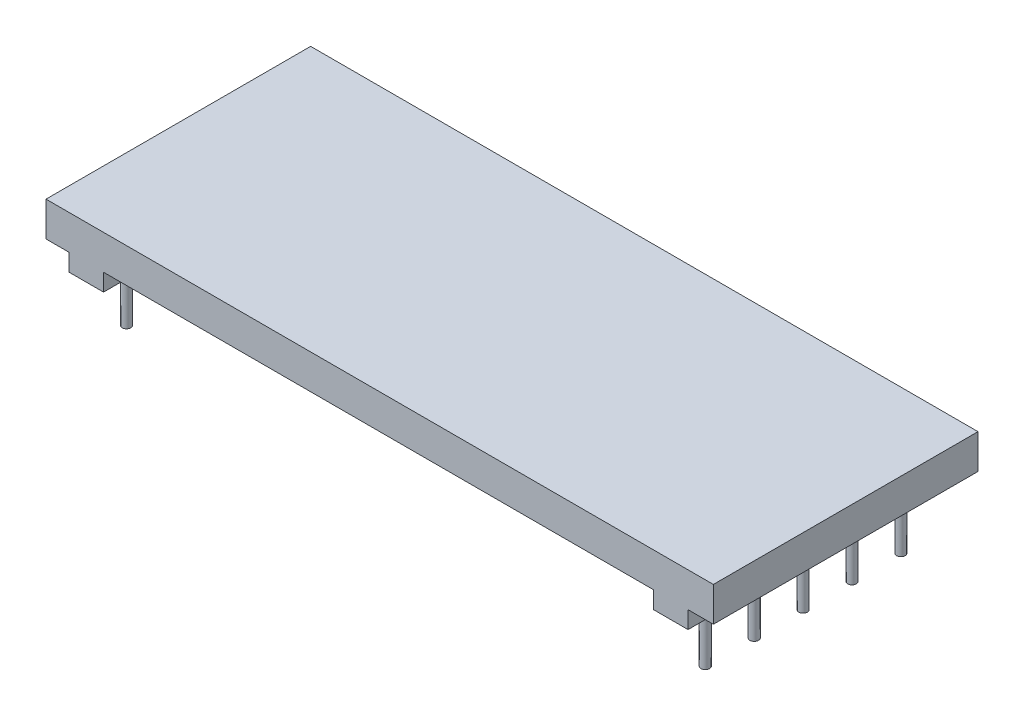
ISO-10303-21;
HEADER;
FILE_DESCRIPTION(('STEP AP214'),'2;1');
FILE_NAME('part.step','',(''),(''),'','','');
FILE_SCHEMA(('AUTOMOTIVE_DESIGN { 1 0 10303 214 1 1 1 1 }'));
ENDSEC;
DATA;
#1=APPLICATION_CONTEXT('core data for automotive mechanical design processes');
#2=APPLICATION_PROTOCOL_DEFINITION('international standard','automotive_design',2000,#1);
#3=PRODUCT_CONTEXT('',#1,'mechanical');
#4=PRODUCT('Part','Part','',(#3));
#5=PRODUCT_RELATED_PRODUCT_CATEGORY('part','',(#4));
#6=PRODUCT_DEFINITION_FORMATION('','',#4);
#7=PRODUCT_DEFINITION_CONTEXT('part definition',#1,'design');
#8=PRODUCT_DEFINITION('design','',#6,#7);
#9=PRODUCT_DEFINITION_SHAPE('','',#8);
#10=(LENGTH_UNIT() NAMED_UNIT(*) SI_UNIT(.MILLI.,.METRE.));
#11=(NAMED_UNIT(*) PLANE_ANGLE_UNIT() SI_UNIT($,.RADIAN.));
#12=(NAMED_UNIT(*) SI_UNIT($,.STERADIAN.) SOLID_ANGLE_UNIT());
#13=UNCERTAINTY_MEASURE_WITH_UNIT(LENGTH_MEASURE(1.E-05),#10,'distance_accuracy_value','');
#14=(GEOMETRIC_REPRESENTATION_CONTEXT(3) GLOBAL_UNCERTAINTY_ASSIGNED_CONTEXT((#13)) GLOBAL_UNIT_ASSIGNED_CONTEXT((#10,
#11,#12)) REPRESENTATION_CONTEXT('',''));
#15=CARTESIAN_POINT('',(0.,0.,0.));
#16=DIRECTION('',(0.,0.,1.));
#17=DIRECTION('',(1.,0.,0.));
#18=AXIS2_PLACEMENT_3D('',#15,#16,#17);
#19=CARTESIAN_POINT('',(50.8,-1.5,0.));
#20=DIRECTION('',(0.,-1.,0.));
#21=DIRECTION('',(0.,0.,-1.));
#22=AXIS2_PLACEMENT_3D('',#19,#20,#21);
#23=PLANE('',#22);
#24=CARTESIAN_POINT('',(25.3000000000001,-1.5,-4.25));
#25=DIRECTION('',(0.,-1.,0.));
#26=DIRECTION('',(0.,0.,-1.));
#27=AXIS2_PLACEMENT_3D('',#24,#25,#26);
#28=CIRCLE('',#27,0.374999999999999);
#29=CARTESIAN_POINT('',(25.3000000000001,-1.5,-4.625));
#30=VERTEX_POINT('',#29);
#31=EDGE_CURVE('E305',#30,#30,#28,.T.);
#32=ORIENTED_EDGE('',*,*,#31,.F.);
#33=EDGE_LOOP('',(#32));
#34=FACE_BOUND('',#33,.T.);
#35=CARTESIAN_POINT('',(25.3,-1.5,4.25));
#36=DIRECTION('',(0.,-1.,0.));
#37=DIRECTION('',(0.,0.,-1.));
#38=AXIS2_PLACEMENT_3D('',#35,#36,#37);
#39=CIRCLE('',#38,0.374999999999999);
#40=CARTESIAN_POINT('',(25.3,-1.5,3.875));
#41=VERTEX_POINT('',#40);
#42=EDGE_CURVE('E293',#41,#41,#39,.T.);
#43=ORIENTED_EDGE('',*,*,#42,.F.);
#44=EDGE_LOOP('',(#43));
#45=FACE_BOUND('',#44,.T.);
#46=DIRECTION('',(0.,0.,-1.));
#47=VECTOR('',#46,1.);
#48=CARTESIAN_POINT('',(23.8,-1.5,11.5));
#49=LINE('',#48,#47);
#50=CARTESIAN_POINT('',(23.8,-1.5,11.5));
#51=VERTEX_POINT('',#50);
#52=CARTESIAN_POINT('',(23.8,-1.5,-11.5));
#53=VERTEX_POINT('',#52);
#54=EDGE_CURVE('E137',#51,#53,#49,.T.);
#55=ORIENTED_EDGE('',*,*,#54,.T.);
#56=DIRECTION('',(1.,0.,0.));
#57=VECTOR('',#56,1.);
#58=CARTESIAN_POINT('',(23.8,-1.5,-11.5));
#59=LINE('',#58,#57);
#60=CARTESIAN_POINT('',(26.8,-1.5,-11.5));
#61=VERTEX_POINT('',#60);
#62=EDGE_CURVE('E126',#53,#61,#59,.T.);
#63=ORIENTED_EDGE('',*,*,#62,.T.);
#64=DIRECTION('',(0.,0.,1.));
#65=VECTOR('',#64,1.);
#66=CARTESIAN_POINT('',(26.8,-1.5,11.5));
#67=LINE('',#66,#65);
#68=CARTESIAN_POINT('',(26.8,-1.5,11.5));
#69=VERTEX_POINT('',#68);
#70=EDGE_CURVE('E136',#61,#69,#67,.T.);
#71=ORIENTED_EDGE('',*,*,#70,.T.);
#72=DIRECTION('',(-1.,0.,0.));
#73=VECTOR('',#72,1.);
#74=CARTESIAN_POINT('',(23.8,-1.5,11.5));
#75=LINE('',#74,#73);
#76=EDGE_CURVE('E141',#69,#51,#75,.T.);
#77=ORIENTED_EDGE('',*,*,#76,.T.);
#78=EDGE_LOOP('',(#55,#63,#71,#77));
#79=FACE_BOUND('',#78,.T.);
#80=CARTESIAN_POINT('',(25.3,-1.5,8.5));
#81=DIRECTION('',(0.,-1.,0.));
#82=DIRECTION('',(0.,0.,-1.));
#83=AXIS2_PLACEMENT_3D('',#80,#81,#82);
#84=CIRCLE('',#83,0.374999999999999);
#85=CARTESIAN_POINT('',(25.3,-1.5,8.12500000000001));
#86=VERTEX_POINT('',#85);
#87=EDGE_CURVE('E283',#86,#86,#84,.T.);
#88=ORIENTED_EDGE('',*,*,#87,.F.);
#89=EDGE_LOOP('',(#88));
#90=FACE_BOUND('',#89,.T.);
#91=CARTESIAN_POINT('',(25.3000000000001,-1.5,0.));
#92=DIRECTION('',(0.,-1.,0.));
#93=DIRECTION('',(0.,0.,-1.));
#94=AXIS2_PLACEMENT_3D('',#91,#92,#93);
#95=CIRCLE('',#94,0.374999999999999);
#96=CARTESIAN_POINT('',(25.3000000000001,-1.5,-0.374999999999996));
#97=VERTEX_POINT('',#96);
#98=EDGE_CURVE('E299',#97,#97,#95,.T.);
#99=ORIENTED_EDGE('',*,*,#98,.F.);
#100=EDGE_LOOP('',(#99));
#101=FACE_BOUND('',#100,.T.);
#102=CARTESIAN_POINT('',(25.3000000000002,-1.5,-8.5));
#103=DIRECTION('',(0.,-1.,0.));
#104=DIRECTION('',(0.,0.,-1.));
#105=AXIS2_PLACEMENT_3D('',#102,#103,#104);
#106=CIRCLE('',#105,0.374999999999999);
#107=CARTESIAN_POINT('',(25.3000000000002,-1.5,-8.875));
#108=VERTEX_POINT('',#107);
#109=EDGE_CURVE('E311',#108,#108,#106,.T.);
#110=ORIENTED_EDGE('',*,*,#109,.F.);
#111=EDGE_LOOP('',(#110));
#112=FACE_BOUND('',#111,.T.);
#113=ADVANCED_FACE('F34',(#34,#45,#79,#90,#101,#112),#23,.T.);
#114=CARTESIAN_POINT('',(0.,0.,0.));
#115=DIRECTION('',(0.,1.,0.));
#116=DIRECTION('',(0.,0.,1.));
#117=AXIS2_PLACEMENT_3D('',#114,#115,#116);
#118=PLANE('',#117);
#119=DIRECTION('',(0.,0.,-1.));
#120=VECTOR('',#119,1.);
#121=CARTESIAN_POINT('',(23.8,0.,11.5));
#122=LINE('',#121,#120);
#123=CARTESIAN_POINT('',(23.8,0.,11.5));
#124=VERTEX_POINT('',#123);
#125=CARTESIAN_POINT('',(23.8,0.,-11.5));
#126=VERTEX_POINT('',#125);
#127=EDGE_CURVE('E148',#124,#126,#122,.T.);
#128=ORIENTED_EDGE('',*,*,#127,.F.);
#129=DIRECTION('',(1.,0.,0.));
#130=VECTOR('',#129,1.);
#131=CARTESIAN_POINT('',(-29.,0.,11.5));
#132=LINE('',#131,#130);
#133=CARTESIAN_POINT('',(-24.,0.,11.5));
#134=VERTEX_POINT('',#133);
#135=EDGE_CURVE('E200',#134,#124,#132,.T.);
#136=ORIENTED_EDGE('',*,*,#135,.F.);
#137=DIRECTION('',(0.,0.,1.));
#138=VECTOR('',#137,1.);
#139=CARTESIAN_POINT('',(-24.,0.,11.5));
#140=LINE('',#139,#138);
#141=CARTESIAN_POINT('',(-24.,0.,-11.5));
#142=VERTEX_POINT('',#141);
#143=EDGE_CURVE('E177',#142,#134,#140,.T.);
#144=ORIENTED_EDGE('',*,*,#143,.F.);
#145=DIRECTION('',(-1.,0.,0.));
#146=VECTOR('',#145,1.);
#147=CARTESIAN_POINT('',(-29.,0.,-11.5));
#148=LINE('',#147,#146);
#149=EDGE_CURVE('E38',#126,#142,#148,.T.);
#150=ORIENTED_EDGE('',*,*,#149,.F.);
#151=EDGE_LOOP('',(#128,#136,#144,#150));
#152=FACE_BOUND('',#151,.T.);
#153=ADVANCED_FACE('F278',(#152),#118,.F.);
#154=DIRECTION('',(0.,0.,1.));
#155=VECTOR('',#154,1.);
#156=CARTESIAN_POINT('',(26.8,0.,11.5));
#157=LINE('',#156,#155);
#158=CARTESIAN_POINT('',(26.8,0.,-11.5));
#159=VERTEX_POINT('',#158);
#160=CARTESIAN_POINT('',(26.8,0.,11.5));
#161=VERTEX_POINT('',#160);
#162=EDGE_CURVE('E144',#159,#161,#157,.T.);
#163=ORIENTED_EDGE('',*,*,#162,.F.);
#164=CARTESIAN_POINT('',(29.,0.,-11.5));
#165=VERTEX_POINT('',#164);
#166=EDGE_CURVE('E244',#165,#159,#148,.T.);
#167=ORIENTED_EDGE('',*,*,#166,.F.);
#168=DIRECTION('',(0.,0.,-1.));
#169=VECTOR('',#168,1.);
#170=CARTESIAN_POINT('',(29.,0.,-11.5));
#171=LINE('',#170,#169);
#172=CARTESIAN_POINT('',(29.,0.,11.5));
#173=VERTEX_POINT('',#172);
#174=EDGE_CURVE('E237',#173,#165,#171,.T.);
#175=ORIENTED_EDGE('',*,*,#174,.F.);
#176=EDGE_CURVE('E198',#161,#173,#132,.T.);
#177=ORIENTED_EDGE('',*,*,#176,.F.);
#178=EDGE_LOOP('',(#163,#167,#175,#177));
#179=FACE_BOUND('',#178,.T.);
#180=ADVANCED_FACE('F332',(#179),#118,.F.);
#181=CARTESIAN_POINT('',(0.,-1.5,0.));
#182=DIRECTION('',(0.,-1.,0.));
#183=DIRECTION('',(0.,0.,-1.));
#184=AXIS2_PLACEMENT_3D('',#181,#182,#183);
#185=PLANE('',#184);
#186=CARTESIAN_POINT('',(-25.4999999999999,-1.5,0.));
#187=DIRECTION('',(0.,-1.,0.));
#188=DIRECTION('',(0.,0.,-1.));
#189=AXIS2_PLACEMENT_3D('',#186,#187,#188);
#190=CIRCLE('',#189,0.374999999999999);
#191=CARTESIAN_POINT('',(-25.4999999999999,-1.5,-0.374999999999996));
#192=VERTEX_POINT('',#191);
#193=EDGE_CURVE('E159',#192,#192,#190,.T.);
#194=ORIENTED_EDGE('',*,*,#193,.F.);
#195=EDGE_LOOP('',(#194));
#196=FACE_BOUND('',#195,.T.);
#197=DIRECTION('',(0.,0.,-1.));
#198=VECTOR('',#197,1.);
#199=CARTESIAN_POINT('',(-27.,-1.5,11.5));
#200=LINE('',#199,#198);
#201=CARTESIAN_POINT('',(-27.,-1.5,11.5));
#202=VERTEX_POINT('',#201);
#203=CARTESIAN_POINT('',(-27.,-1.5,-11.5));
#204=VERTEX_POINT('',#203);
#205=EDGE_CURVE('E173',#202,#204,#200,.T.);
#206=ORIENTED_EDGE('',*,*,#205,.T.);
#207=DIRECTION('',(1.,0.,0.));
#208=VECTOR('',#207,1.);
#209=CARTESIAN_POINT('',(-27.,-1.5,-11.5));
#210=LINE('',#209,#208);
#211=CARTESIAN_POINT('',(-24.,-1.5,-11.5));
#212=VERTEX_POINT('',#211);
#213=EDGE_CURVE('E176',#204,#212,#210,.T.);
#214=ORIENTED_EDGE('',*,*,#213,.T.);
#215=DIRECTION('',(0.,0.,1.));
#216=VECTOR('',#215,1.);
#217=CARTESIAN_POINT('',(-24.,-1.5,11.5));
#218=LINE('',#217,#216);
#219=CARTESIAN_POINT('',(-24.,-1.5,11.5));
#220=VERTEX_POINT('',#219);
#221=EDGE_CURVE('E179',#212,#220,#218,.T.);
#222=ORIENTED_EDGE('',*,*,#221,.T.);
#223=DIRECTION('',(-1.,0.,0.));
#224=VECTOR('',#223,1.);
#225=CARTESIAN_POINT('',(-27.,-1.5,11.5));
#226=LINE('',#225,#224);
#227=EDGE_CURVE('E181',#220,#202,#226,.T.);
#228=ORIENTED_EDGE('',*,*,#227,.T.);
#229=EDGE_LOOP('',(#206,#214,#222,#228));
#230=FACE_BOUND('',#229,.T.);
#231=CARTESIAN_POINT('',(-25.5,-1.5,8.));
#232=DIRECTION('',(0.,-1.,0.));
#233=DIRECTION('',(0.,0.,-1.));
#234=AXIS2_PLACEMENT_3D('',#231,#232,#233);
#235=CIRCLE('',#234,0.374999999999999);
#236=CARTESIAN_POINT('',(-25.5,-1.5,7.625));
#237=VERTEX_POINT('',#236);
#238=EDGE_CURVE('E164',#237,#237,#235,.T.);
#239=ORIENTED_EDGE('',*,*,#238,.F.);
#240=EDGE_LOOP('',(#239));
#241=FACE_BOUND('',#240,.T.);
#242=CARTESIAN_POINT('',(-25.4999999999998,-1.5,-8.));
#243=DIRECTION('',(0.,-1.,0.));
#244=DIRECTION('',(0.,0.,-1.));
#245=AXIS2_PLACEMENT_3D('',#242,#243,#244);
#246=CIRCLE('',#245,0.374999999999999);
#247=CARTESIAN_POINT('',(-25.4999999999998,-1.5,-8.37499999999999));
#248=VERTEX_POINT('',#247);
#249=EDGE_CURVE('E150',#248,#248,#246,.T.);
#250=ORIENTED_EDGE('',*,*,#249,.F.);
#251=EDGE_LOOP('',(#250));
#252=FACE_BOUND('',#251,.T.);
#253=ADVANCED_FACE('F260',(#196,#230,#241,#252),#185,.T.);
#254=DIRECTION('',(0.,0.,-1.));
#255=VECTOR('',#254,1.);
#256=CARTESIAN_POINT('',(-27.,0.,11.5));
#257=LINE('',#256,#255);
#258=CARTESIAN_POINT('',(-27.,0.,11.5));
#259=VERTEX_POINT('',#258);
#260=CARTESIAN_POINT('',(-27.,0.,-11.5));
#261=VERTEX_POINT('',#260);
#262=EDGE_CURVE('E170',#259,#261,#257,.T.);
#263=ORIENTED_EDGE('',*,*,#262,.F.);
#264=CARTESIAN_POINT('',(-29.,0.,11.5));
#265=VERTEX_POINT('',#264);
#266=EDGE_CURVE('E212',#265,#259,#132,.T.);
#267=ORIENTED_EDGE('',*,*,#266,.F.);
#268=DIRECTION('',(0.,0.,1.));
#269=VECTOR('',#268,1.);
#270=CARTESIAN_POINT('',(-29.,0.,-11.5));
#271=LINE('',#270,#269);
#272=CARTESIAN_POINT('',(-29.,0.,-11.5));
#273=VERTEX_POINT('',#272);
#274=EDGE_CURVE('E201',#273,#265,#271,.T.);
#275=ORIENTED_EDGE('',*,*,#274,.F.);
#276=EDGE_CURVE('E60',#261,#273,#148,.T.);
#277=ORIENTED_EDGE('',*,*,#276,.F.);
#278=EDGE_LOOP('',(#263,#267,#275,#277));
#279=FACE_BOUND('',#278,.T.);
#280=ADVANCED_FACE('F252',(#279),#118,.F.);
#281=CARTESIAN_POINT('',(29.,3.,-11.5));
#282=DIRECTION('',(-1.,0.,0.));
#283=DIRECTION('',(0.,0.,1.));
#284=AXIS2_PLACEMENT_3D('',#281,#282,#283);
#285=PLANE('',#284);
#286=ORIENTED_EDGE('',*,*,#174,.T.);
#287=DIRECTION('',(0.,-1.,0.));
#288=VECTOR('',#287,1.);
#289=CARTESIAN_POINT('',(29.,3.,-11.5));
#290=LINE('',#289,#288);
#291=CARTESIAN_POINT('',(29.,3.,-11.5));
#292=VERTEX_POINT('',#291);
#293=EDGE_CURVE('E11',#292,#165,#290,.T.);
#294=ORIENTED_EDGE('',*,*,#293,.F.);
#295=DIRECTION('',(0.,0.,-1.));
#296=VECTOR('',#295,1.);
#297=CARTESIAN_POINT('',(29.,3.,-11.5));
#298=LINE('',#297,#296);
#299=CARTESIAN_POINT('',(29.,3.,11.5));
#300=VERTEX_POINT('',#299);
#301=EDGE_CURVE('E214',#300,#292,#298,.T.);
#302=ORIENTED_EDGE('',*,*,#301,.F.);
#303=DIRECTION('',(0.,-1.,0.));
#304=VECTOR('',#303,1.);
#305=CARTESIAN_POINT('',(29.,3.,11.5));
#306=LINE('',#305,#304);
#307=EDGE_CURVE('E205',#300,#173,#306,.T.);
#308=ORIENTED_EDGE('',*,*,#307,.T.);
#309=EDGE_LOOP('',(#286,#294,#302,#308));
#310=FACE_BOUND('',#309,.T.);
#311=ADVANCED_FACE('F36',(#310),#285,.F.);
#312=CARTESIAN_POINT('',(-29.,3.,-11.5));
#313=DIRECTION('',(0.,0.,1.));
#314=DIRECTION('',(1.,0.,0.));
#315=AXIS2_PLACEMENT_3D('',#312,#313,#314);
#316=PLANE('',#315);
#317=ORIENTED_EDGE('',*,*,#166,.T.);
#318=DIRECTION('',(0.,1.,0.));
#319=VECTOR('',#318,1.);
#320=CARTESIAN_POINT('',(26.8,-1.5,-11.5));
#321=LINE('',#320,#319);
#322=EDGE_CURVE('E133',#61,#159,#321,.T.);
#323=ORIENTED_EDGE('',*,*,#322,.F.);
#324=ORIENTED_EDGE('',*,*,#62,.F.);
#325=DIRECTION('',(0.,1.,0.));
#326=VECTOR('',#325,1.);
#327=CARTESIAN_POINT('',(23.8,-1.5,-11.5));
#328=LINE('',#327,#326);
#329=EDGE_CURVE('E131',#53,#126,#328,.T.);
#330=ORIENTED_EDGE('',*,*,#329,.T.);
#331=ORIENTED_EDGE('',*,*,#149,.T.);
#332=DIRECTION('',(0.,1.,0.));
#333=VECTOR('',#332,1.);
#334=CARTESIAN_POINT('',(-24.,-1.5,-11.5));
#335=LINE('',#334,#333);
#336=EDGE_CURVE('E268',#212,#142,#335,.T.);
#337=ORIENTED_EDGE('',*,*,#336,.F.);
#338=ORIENTED_EDGE('',*,*,#213,.F.);
#339=DIRECTION('',(0.,1.,0.));
#340=VECTOR('',#339,1.);
#341=CARTESIAN_POINT('',(-27.,-1.5,-11.5));
#342=LINE('',#341,#340);
#343=EDGE_CURVE('E238',#204,#261,#342,.T.);
#344=ORIENTED_EDGE('',*,*,#343,.T.);
#345=ORIENTED_EDGE('',*,*,#276,.T.);
#346=DIRECTION('',(0.,-1.,0.));
#347=VECTOR('',#346,1.);
#348=CARTESIAN_POINT('',(-29.,3.,-11.5));
#349=LINE('',#348,#347);
#350=CARTESIAN_POINT('',(-29.,3.,-11.5));
#351=VERTEX_POINT('',#350);
#352=EDGE_CURVE('E44',#351,#273,#349,.T.);
#353=ORIENTED_EDGE('',*,*,#352,.F.);
#354=DIRECTION('',(-1.,0.,0.));
#355=VECTOR('',#354,1.);
#356=CARTESIAN_POINT('',(-29.,3.,-11.5));
#357=LINE('',#356,#355);
#358=EDGE_CURVE('E233',#292,#351,#357,.T.);
#359=ORIENTED_EDGE('',*,*,#358,.F.);
#360=ORIENTED_EDGE('',*,*,#293,.T.);
#361=EDGE_LOOP('',(#317,#323,#324,#330,#331,#337,#338,#344,#345,#353,#359,#360));
#362=FACE_BOUND('',#361,.T.);
#363=ADVANCED_FACE('F129',(#362),#316,.F.);
#364=CARTESIAN_POINT('',(-29.,3.,-11.5));
#365=DIRECTION('',(1.,0.,0.));
#366=DIRECTION('',(0.,0.,-1.));
#367=AXIS2_PLACEMENT_3D('',#364,#365,#366);
#368=PLANE('',#367);
#369=ORIENTED_EDGE('',*,*,#274,.T.);
#370=DIRECTION('',(0.,-1.,0.));
#371=VECTOR('',#370,1.);
#372=CARTESIAN_POINT('',(-29.,3.,11.5));
#373=LINE('',#372,#371);
#374=CARTESIAN_POINT('',(-29.,3.,11.5));
#375=VERTEX_POINT('',#374);
#376=EDGE_CURVE('E217',#375,#265,#373,.T.);
#377=ORIENTED_EDGE('',*,*,#376,.F.);
#378=DIRECTION('',(0.,0.,1.));
#379=VECTOR('',#378,1.);
#380=CARTESIAN_POINT('',(-29.,3.,-11.5));
#381=LINE('',#380,#379);
#382=EDGE_CURVE('E229',#351,#375,#381,.T.);
#383=ORIENTED_EDGE('',*,*,#382,.F.);
#384=ORIENTED_EDGE('',*,*,#352,.T.);
#385=EDGE_LOOP('',(#369,#377,#383,#384));
#386=FACE_BOUND('',#385,.T.);
#387=ADVANCED_FACE('F251',(#386),#368,.F.);
#388=CARTESIAN_POINT('',(-29.,3.,11.5));
#389=DIRECTION('',(0.,0.,-1.));
#390=DIRECTION('',(-1.,0.,0.));
#391=AXIS2_PLACEMENT_3D('',#388,#389,#390);
#392=PLANE('',#391);
#393=ORIENTED_EDGE('',*,*,#266,.T.);
#394=DIRECTION('',(0.,1.,0.));
#395=VECTOR('',#394,1.);
#396=CARTESIAN_POINT('',(-27.,-1.5,11.5));
#397=LINE('',#396,#395);
#398=EDGE_CURVE('E183',#202,#259,#397,.T.);
#399=ORIENTED_EDGE('',*,*,#398,.F.);
#400=ORIENTED_EDGE('',*,*,#227,.F.);
#401=DIRECTION('',(0.,1.,0.));
#402=VECTOR('',#401,1.);
#403=CARTESIAN_POINT('',(-24.,-1.5,11.5));
#404=LINE('',#403,#402);
#405=EDGE_CURVE('E196',#220,#134,#404,.T.);
#406=ORIENTED_EDGE('',*,*,#405,.T.);
#407=ORIENTED_EDGE('',*,*,#135,.T.);
#408=DIRECTION('',(0.,1.,0.));
#409=VECTOR('',#408,1.);
#410=CARTESIAN_POINT('',(23.8,-1.5,11.5));
#411=LINE('',#410,#409);
#412=EDGE_CURVE('E288',#51,#124,#411,.T.);
#413=ORIENTED_EDGE('',*,*,#412,.F.);
#414=ORIENTED_EDGE('',*,*,#76,.F.);
#415=DIRECTION('',(0.,1.,0.));
#416=VECTOR('',#415,1.);
#417=CARTESIAN_POINT('',(26.8,-1.5,11.5));
#418=LINE('',#417,#416);
#419=EDGE_CURVE('E52',#69,#161,#418,.T.);
#420=ORIENTED_EDGE('',*,*,#419,.T.);
#421=ORIENTED_EDGE('',*,*,#176,.T.);
#422=ORIENTED_EDGE('',*,*,#307,.F.);
#423=DIRECTION('',(1.,0.,0.));
#424=VECTOR('',#423,1.);
#425=CARTESIAN_POINT('',(-29.,3.,11.5));
#426=LINE('',#425,#424);
#427=EDGE_CURVE('E223',#375,#300,#426,.T.);
#428=ORIENTED_EDGE('',*,*,#427,.F.);
#429=ORIENTED_EDGE('',*,*,#376,.T.);
#430=EDGE_LOOP('',(#393,#399,#400,#406,#407,#413,#414,#420,#421,#422,#428,#429));
#431=FACE_BOUND('',#430,.T.);
#432=ADVANCED_FACE('F254',(#431),#392,.F.);
#433=CARTESIAN_POINT('',(0.,3.,0.));
#434=DIRECTION('',(0.,1.,0.));
#435=DIRECTION('',(0.,0.,1.));
#436=AXIS2_PLACEMENT_3D('',#433,#434,#435);
#437=PLANE('',#436);
#438=ORIENTED_EDGE('',*,*,#301,.T.);
#439=ORIENTED_EDGE('',*,*,#358,.T.);
#440=ORIENTED_EDGE('',*,*,#382,.T.);
#441=ORIENTED_EDGE('',*,*,#427,.T.);
#442=EDGE_LOOP('',(#438,#439,#440,#441));
#443=FACE_BOUND('',#442,.T.);
#444=ADVANCED_FACE('F377',(#443),#437,.T.);
#445=CARTESIAN_POINT('',(-27.,-1.5,11.5));
#446=DIRECTION('',(1.,0.,0.));
#447=DIRECTION('',(0.,0.,-1.));
#448=AXIS2_PLACEMENT_3D('',#445,#446,#447);
#449=PLANE('',#448);
#450=ORIENTED_EDGE('',*,*,#262,.T.);
#451=ORIENTED_EDGE('',*,*,#343,.F.);
#452=ORIENTED_EDGE('',*,*,#205,.F.);
#453=ORIENTED_EDGE('',*,*,#398,.T.);
#454=EDGE_LOOP('',(#450,#451,#452,#453));
#455=FACE_BOUND('',#454,.T.);
#456=ADVANCED_FACE('F258',(#455),#449,.F.);
#457=CARTESIAN_POINT('',(-24.,-1.5,11.5));
#458=DIRECTION('',(-1.,0.,0.));
#459=DIRECTION('',(0.,0.,1.));
#460=AXIS2_PLACEMENT_3D('',#457,#458,#459);
#461=PLANE('',#460);
#462=ORIENTED_EDGE('',*,*,#143,.T.);
#463=ORIENTED_EDGE('',*,*,#405,.F.);
#464=ORIENTED_EDGE('',*,*,#221,.F.);
#465=ORIENTED_EDGE('',*,*,#336,.T.);
#466=EDGE_LOOP('',(#462,#463,#464,#465));
#467=FACE_BOUND('',#466,.T.);
#468=ADVANCED_FACE('F276',(#467),#461,.F.);
#469=CARTESIAN_POINT('',(-25.5,-6.5,8.));
#470=DIRECTION('',(0.,1.,0.));
#471=DIRECTION('',(0.,0.,1.));
#472=AXIS2_PLACEMENT_3D('',#469,#470,#471);
#473=CYLINDRICAL_SURFACE('',#472,0.374999999999999);
#474=CARTESIAN_POINT('',(-25.5,-6.5,8.));
#475=DIRECTION('',(0.,-1.,0.));
#476=DIRECTION('',(0.,0.,-1.));
#477=AXIS2_PLACEMENT_3D('',#474,#475,#476);
#478=CIRCLE('',#477,0.374999999999999);
#479=CARTESIAN_POINT('',(-25.5,-6.5,7.625));
#480=VERTEX_POINT('',#479);
#481=EDGE_CURVE('E167',#480,#480,#478,.T.);
#482=ORIENTED_EDGE('',*,*,#481,.F.);
#483=EDGE_LOOP('',(#482));
#484=FACE_BOUND('',#483,.T.);
#485=ORIENTED_EDGE('',*,*,#238,.T.);
#486=EDGE_LOOP('',(#485));
#487=FACE_BOUND('',#486,.T.);
#488=ADVANCED_FACE('F365',(#484,#487),#473,.T.);
#489=CARTESIAN_POINT('',(-25.5,-6.5,8.));
#490=DIRECTION('',(0.,-1.,0.));
#491=DIRECTION('',(0.,0.,-1.));
#492=AXIS2_PLACEMENT_3D('',#489,#490,#491);
#493=PLANE('',#492);
#494=ORIENTED_EDGE('',*,*,#481,.T.);
#495=EDGE_LOOP('',(#494));
#496=FACE_BOUND('',#495,.T.);
#497=ADVANCED_FACE('F361',(#496),#493,.T.);
#498=CARTESIAN_POINT('',(-25.4999999999999,-6.5,0.));
#499=DIRECTION('',(0.,1.,0.));
#500=DIRECTION('',(0.,0.,1.));
#501=AXIS2_PLACEMENT_3D('',#498,#499,#500);
#502=CYLINDRICAL_SURFACE('',#501,0.374999999999999);
#503=CARTESIAN_POINT('',(-25.4999999999999,-6.5,0.));
#504=DIRECTION('',(0.,-1.,0.));
#505=DIRECTION('',(0.,0.,-1.));
#506=AXIS2_PLACEMENT_3D('',#503,#504,#505);
#507=CIRCLE('',#506,0.374999999999999);
#508=CARTESIAN_POINT('',(-25.4999999999999,-6.5,-0.374999999999996));
#509=VERTEX_POINT('',#508);
#510=EDGE_CURVE('E161',#509,#509,#507,.T.);
#511=ORIENTED_EDGE('',*,*,#510,.F.);
#512=EDGE_LOOP('',(#511));
#513=FACE_BOUND('',#512,.T.);
#514=ORIENTED_EDGE('',*,*,#193,.T.);
#515=EDGE_LOOP('',(#514));
#516=FACE_BOUND('',#515,.T.);
#517=ADVANCED_FACE('F357',(#513,#516),#502,.T.);
#518=CARTESIAN_POINT('',(-25.4999999999999,-6.5,0.));
#519=DIRECTION('',(0.,-1.,0.));
#520=DIRECTION('',(0.,0.,-1.));
#521=AXIS2_PLACEMENT_3D('',#518,#519,#520);
#522=PLANE('',#521);
#523=ORIENTED_EDGE('',*,*,#510,.T.);
#524=EDGE_LOOP('',(#523));
#525=FACE_BOUND('',#524,.T.);
#526=ADVANCED_FACE('F353',(#525),#522,.T.);
#527=CARTESIAN_POINT('',(-25.4999999999998,-6.5,-8.));
#528=DIRECTION('',(0.,1.,0.));
#529=DIRECTION('',(0.,0.,1.));
#530=AXIS2_PLACEMENT_3D('',#527,#528,#529);
#531=CYLINDRICAL_SURFACE('',#530,0.374999999999999);
#532=CARTESIAN_POINT('',(-25.4999999999998,-6.5,-8.));
#533=DIRECTION('',(0.,-1.,0.));
#534=DIRECTION('',(0.,0.,-1.));
#535=AXIS2_PLACEMENT_3D('',#532,#533,#534);
#536=CIRCLE('',#535,0.374999999999999);
#537=CARTESIAN_POINT('',(-25.4999999999998,-6.5,-8.37499999999999));
#538=VERTEX_POINT('',#537);
#539=EDGE_CURVE('E153',#538,#538,#536,.T.);
#540=ORIENTED_EDGE('',*,*,#539,.F.);
#541=EDGE_LOOP('',(#540));
#542=FACE_BOUND('',#541,.T.);
#543=ORIENTED_EDGE('',*,*,#249,.T.);
#544=EDGE_LOOP('',(#543));
#545=FACE_BOUND('',#544,.T.);
#546=ADVANCED_FACE('F349',(#542,#545),#531,.T.);
#547=CARTESIAN_POINT('',(-25.4999999999998,-6.5,-8.));
#548=DIRECTION('',(0.,-1.,0.));
#549=DIRECTION('',(0.,0.,-1.));
#550=AXIS2_PLACEMENT_3D('',#547,#548,#549);
#551=PLANE('',#550);
#552=ORIENTED_EDGE('',*,*,#539,.T.);
#553=EDGE_LOOP('',(#552));
#554=FACE_BOUND('',#553,.T.);
#555=ADVANCED_FACE('F346',(#554),#551,.T.);
#556=CARTESIAN_POINT('',(23.8,-1.5,11.5));
#557=DIRECTION('',(1.,0.,0.));
#558=DIRECTION('',(0.,0.,-1.));
#559=AXIS2_PLACEMENT_3D('',#556,#557,#558);
#560=PLANE('',#559);
#561=ORIENTED_EDGE('',*,*,#127,.T.);
#562=ORIENTED_EDGE('',*,*,#329,.F.);
#563=ORIENTED_EDGE('',*,*,#54,.F.);
#564=ORIENTED_EDGE('',*,*,#412,.T.);
#565=EDGE_LOOP('',(#561,#562,#563,#564));
#566=FACE_BOUND('',#565,.T.);
#567=ADVANCED_FACE('F146',(#566),#560,.F.);
#568=CARTESIAN_POINT('',(26.8,-1.5,11.5));
#569=DIRECTION('',(-1.,0.,0.));
#570=DIRECTION('',(0.,0.,1.));
#571=AXIS2_PLACEMENT_3D('',#568,#569,#570);
#572=PLANE('',#571);
#573=ORIENTED_EDGE('',*,*,#162,.T.);
#574=ORIENTED_EDGE('',*,*,#419,.F.);
#575=ORIENTED_EDGE('',*,*,#70,.F.);
#576=ORIENTED_EDGE('',*,*,#322,.T.);
#577=EDGE_LOOP('',(#573,#574,#575,#576));
#578=FACE_BOUND('',#577,.T.);
#579=ADVANCED_FACE('F340',(#578),#572,.F.);
#580=CARTESIAN_POINT('',(25.3,-6.5,8.5));
#581=DIRECTION('',(0.,1.,0.));
#582=DIRECTION('',(0.,0.,1.));
#583=AXIS2_PLACEMENT_3D('',#580,#581,#582);
#584=CYLINDRICAL_SURFACE('',#583,0.374999999999999);
#585=CARTESIAN_POINT('',(25.3,-6.5,8.5));
#586=DIRECTION('',(0.,-1.,0.));
#587=DIRECTION('',(0.,0.,-1.));
#588=AXIS2_PLACEMENT_3D('',#585,#586,#587);
#589=CIRCLE('',#588,0.374999999999999);
#590=CARTESIAN_POINT('',(25.3,-6.5,8.12500000000001));
#591=VERTEX_POINT('',#590);
#592=EDGE_CURVE('E279',#591,#591,#589,.T.);
#593=ORIENTED_EDGE('',*,*,#592,.F.);
#594=EDGE_LOOP('',(#593));
#595=FACE_BOUND('',#594,.T.);
#596=ORIENTED_EDGE('',*,*,#87,.T.);
#597=EDGE_LOOP('',(#596));
#598=FACE_BOUND('',#597,.T.);
#599=ADVANCED_FACE('F338',(#595,#598),#584,.T.);
#600=CARTESIAN_POINT('',(25.3,-6.5,8.5));
#601=DIRECTION('',(0.,-1.,0.));
#602=DIRECTION('',(0.,0.,-1.));
#603=AXIS2_PLACEMENT_3D('',#600,#601,#602);
#604=PLANE('',#603);
#605=ORIENTED_EDGE('',*,*,#592,.T.);
#606=EDGE_LOOP('',(#605));
#607=FACE_BOUND('',#606,.T.);
#608=ADVANCED_FACE('F460',(#607),#604,.T.);
#609=CARTESIAN_POINT('',(25.3,-6.5,4.25));
#610=DIRECTION('',(0.,1.,0.));
#611=DIRECTION('',(0.,0.,1.));
#612=AXIS2_PLACEMENT_3D('',#609,#610,#611);
#613=CYLINDRICAL_SURFACE('',#612,0.374999999999999);
#614=CARTESIAN_POINT('',(25.3,-6.5,4.25));
#615=DIRECTION('',(0.,-1.,0.));
#616=DIRECTION('',(0.,0.,-1.));
#617=AXIS2_PLACEMENT_3D('',#614,#615,#616);
#618=CIRCLE('',#617,0.374999999999999);
#619=CARTESIAN_POINT('',(25.3,-6.5,3.875));
#620=VERTEX_POINT('',#619);
#621=EDGE_CURVE('E291',#620,#620,#618,.T.);
#622=ORIENTED_EDGE('',*,*,#621,.F.);
#623=EDGE_LOOP('',(#622));
#624=FACE_BOUND('',#623,.T.);
#625=ORIENTED_EDGE('',*,*,#42,.T.);
#626=EDGE_LOOP('',(#625));
#627=FACE_BOUND('',#626,.T.);
#628=ADVANCED_FACE('F468',(#624,#627),#613,.T.);
#629=CARTESIAN_POINT('',(25.3,-6.5,4.25));
#630=DIRECTION('',(0.,-1.,0.));
#631=DIRECTION('',(0.,0.,-1.));
#632=AXIS2_PLACEMENT_3D('',#629,#630,#631);
#633=PLANE('',#632);
#634=ORIENTED_EDGE('',*,*,#621,.T.);
#635=EDGE_LOOP('',(#634));
#636=FACE_BOUND('',#635,.T.);
#637=ADVANCED_FACE('F475',(#636),#633,.T.);
#638=CARTESIAN_POINT('',(25.3000000000001,-6.5,0.));
#639=DIRECTION('',(0.,1.,0.));
#640=DIRECTION('',(0.,0.,1.));
#641=AXIS2_PLACEMENT_3D('',#638,#639,#640);
#642=CYLINDRICAL_SURFACE('',#641,0.374999999999999);
#643=CARTESIAN_POINT('',(25.3000000000001,-6.5,0.));
#644=DIRECTION('',(0.,-1.,0.));
#645=DIRECTION('',(0.,0.,-1.));
#646=AXIS2_PLACEMENT_3D('',#643,#644,#645);
#647=CIRCLE('',#646,0.374999999999999);
#648=CARTESIAN_POINT('',(25.3000000000001,-6.5,-0.374999999999996));
#649=VERTEX_POINT('',#648);
#650=EDGE_CURVE('E296',#649,#649,#647,.T.);
#651=ORIENTED_EDGE('',*,*,#650,.F.);
#652=EDGE_LOOP('',(#651));
#653=FACE_BOUND('',#652,.T.);
#654=ORIENTED_EDGE('',*,*,#98,.T.);
#655=EDGE_LOOP('',(#654));
#656=FACE_BOUND('',#655,.T.);
#657=ADVANCED_FACE('F483',(#653,#656),#642,.T.);
#658=CARTESIAN_POINT('',(25.3000000000001,-6.5,0.));
#659=DIRECTION('',(0.,-1.,0.));
#660=DIRECTION('',(0.,0.,-1.));
#661=AXIS2_PLACEMENT_3D('',#658,#659,#660);
#662=PLANE('',#661);
#663=ORIENTED_EDGE('',*,*,#650,.T.);
#664=EDGE_LOOP('',(#663));
#665=FACE_BOUND('',#664,.T.);
#666=ADVANCED_FACE('F491',(#665),#662,.T.);
#667=CARTESIAN_POINT('',(25.3000000000001,-6.5,-4.25));
#668=DIRECTION('',(0.,1.,0.));
#669=DIRECTION('',(0.,0.,1.));
#670=AXIS2_PLACEMENT_3D('',#667,#668,#669);
#671=CYLINDRICAL_SURFACE('',#670,0.374999999999999);
#672=CARTESIAN_POINT('',(25.3000000000001,-6.5,-4.25));
#673=DIRECTION('',(0.,-1.,0.));
#674=DIRECTION('',(0.,0.,-1.));
#675=AXIS2_PLACEMENT_3D('',#672,#673,#674);
#676=CIRCLE('',#675,0.374999999999999);
#677=CARTESIAN_POINT('',(25.3000000000001,-6.5,-4.625));
#678=VERTEX_POINT('',#677);
#679=EDGE_CURVE('E302',#678,#678,#676,.T.);
#680=ORIENTED_EDGE('',*,*,#679,.F.);
#681=EDGE_LOOP('',(#680));
#682=FACE_BOUND('',#681,.T.);
#683=ORIENTED_EDGE('',*,*,#31,.T.);
#684=EDGE_LOOP('',(#683));
#685=FACE_BOUND('',#684,.T.);
#686=ADVANCED_FACE('F499',(#682,#685),#671,.T.);
#687=CARTESIAN_POINT('',(25.3000000000001,-6.5,-4.25));
#688=DIRECTION('',(0.,-1.,0.));
#689=DIRECTION('',(0.,0.,-1.));
#690=AXIS2_PLACEMENT_3D('',#687,#688,#689);
#691=PLANE('',#690);
#692=ORIENTED_EDGE('',*,*,#679,.T.);
#693=EDGE_LOOP('',(#692));
#694=FACE_BOUND('',#693,.T.);
#695=ADVANCED_FACE('F322',(#694),#691,.T.);
#696=CARTESIAN_POINT('',(25.3000000000002,-6.5,-8.5));
#697=DIRECTION('',(0.,1.,0.));
#698=DIRECTION('',(0.,0.,1.));
#699=AXIS2_PLACEMENT_3D('',#696,#697,#698);
#700=CYLINDRICAL_SURFACE('',#699,0.374999999999999);
#701=CARTESIAN_POINT('',(25.3000000000002,-6.5,-8.5));
#702=DIRECTION('',(0.,-1.,0.));
#703=DIRECTION('',(0.,0.,-1.));
#704=AXIS2_PLACEMENT_3D('',#701,#702,#703);
#705=CIRCLE('',#704,0.374999999999999);
#706=CARTESIAN_POINT('',(25.3000000000002,-6.5,-8.875));
#707=VERTEX_POINT('',#706);
#708=EDGE_CURVE('E308',#707,#707,#705,.T.);
#709=ORIENTED_EDGE('',*,*,#708,.F.);
#710=EDGE_LOOP('',(#709));
#711=FACE_BOUND('',#710,.T.);
#712=ORIENTED_EDGE('',*,*,#109,.T.);
#713=EDGE_LOOP('',(#712));
#714=FACE_BOUND('',#713,.T.);
#715=ADVANCED_FACE('F319',(#711,#714),#700,.T.);
#716=CARTESIAN_POINT('',(25.3000000000002,-6.5,-8.5));
#717=DIRECTION('',(0.,-1.,0.));
#718=DIRECTION('',(0.,0.,-1.));
#719=AXIS2_PLACEMENT_3D('',#716,#717,#718);
#720=PLANE('',#719);
#721=ORIENTED_EDGE('',*,*,#708,.T.);
#722=EDGE_LOOP('',(#721));
#723=FACE_BOUND('',#722,.T.);
#724=ADVANCED_FACE('F317',(#723),#720,.T.);
#725=CLOSED_SHELL('',(#113,#153,#180,#253,#280,#311,#363,#387,#432,#444,#456,#468,#488,#497,
#517,#526,#546,#555,#567,#579,#599,#608,#628,#637,#657,#666,#686,#695,#715,#724));
#726=MANIFOLD_SOLID_BREP('B2',#725);
#727=ADVANCED_BREP_SHAPE_REPRESENTATION('',(#18,#726),#14);
#728=SHAPE_DEFINITION_REPRESENTATION(#9,#727);
ENDSEC;
END-ISO-10303-21;
